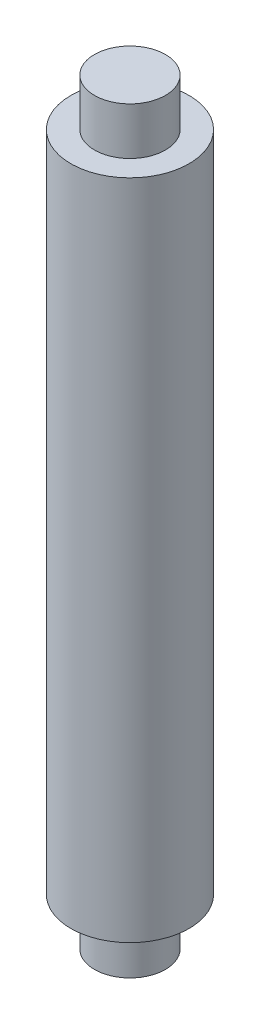
ISO-10303-21;
HEADER;
FILE_DESCRIPTION(('STEP AP214'),'2;1');
FILE_NAME('part.step','',(''),(''),'','','');
FILE_SCHEMA(('AUTOMOTIVE_DESIGN { 1 0 10303 214 1 1 1 1 }'));
ENDSEC;
DATA;
#1=APPLICATION_CONTEXT('core data for automotive mechanical design processes');
#2=APPLICATION_PROTOCOL_DEFINITION('international standard','automotive_design',2000,#1);
#3=PRODUCT_CONTEXT('',#1,'mechanical');
#4=PRODUCT('Part','Part','',(#3));
#5=PRODUCT_RELATED_PRODUCT_CATEGORY('part','',(#4));
#6=PRODUCT_DEFINITION_FORMATION('','',#4);
#7=PRODUCT_DEFINITION_CONTEXT('part definition',#1,'design');
#8=PRODUCT_DEFINITION('design','',#6,#7);
#9=PRODUCT_DEFINITION_SHAPE('','',#8);
#10=(LENGTH_UNIT() NAMED_UNIT(*) SI_UNIT(.MILLI.,.METRE.));
#11=(NAMED_UNIT(*) PLANE_ANGLE_UNIT() SI_UNIT($,.RADIAN.));
#12=(NAMED_UNIT(*) SI_UNIT($,.STERADIAN.) SOLID_ANGLE_UNIT());
#13=UNCERTAINTY_MEASURE_WITH_UNIT(LENGTH_MEASURE(1.E-05),#10,'distance_accuracy_value','');
#14=(GEOMETRIC_REPRESENTATION_CONTEXT(3) GLOBAL_UNCERTAINTY_ASSIGNED_CONTEXT((#13)) GLOBAL_UNIT_ASSIGNED_CONTEXT((#10,
#11,#12)) REPRESENTATION_CONTEXT('',''));
#15=CARTESIAN_POINT('',(0.,0.,0.));
#16=DIRECTION('',(0.,0.,1.));
#17=DIRECTION('',(1.,0.,0.));
#18=AXIS2_PLACEMENT_3D('',#15,#16,#17);
#19=CARTESIAN_POINT('',(-1.5,10.828947368421,0.));
#20=DIRECTION('',(0.,1.,0.));
#21=DIRECTION('',(-1.,0.,0.));
#22=AXIS2_PLACEMENT_3D('',#19,#20,#21);
#23=PLANE('',#22);
#24=CARTESIAN_POINT('',(0.,10.828947368421,0.));
#25=DIRECTION('',(0.,1.,0.));
#26=DIRECTION('',(-1.,0.,0.));
#27=AXIS2_PLACEMENT_3D('',#24,#25,#26);
#28=CIRCLE('',#27,1.5);
#29=CARTESIAN_POINT('',(-1.5,10.828947368421,0.));
#30=VERTEX_POINT('',#29);
#31=EDGE_CURVE('E59',#30,#30,#28,.T.);
#32=ORIENTED_EDGE('',*,*,#31,.T.);
#33=EDGE_LOOP('',(#32));
#34=FACE_BOUND('',#33,.T.);
#35=ADVANCED_FACE('F37',(#34),#23,.T.);
#36=CARTESIAN_POINT('',(0.,-21.171052631579,0.));
#37=DIRECTION('',(0.,-1.,0.));
#38=DIRECTION('',(1.,0.,0.));
#39=AXIS2_PLACEMENT_3D('',#36,#37,#38);
#40=PLANE('',#39);
#41=CARTESIAN_POINT('',(0.,-21.171052631579,0.));
#42=DIRECTION('',(0.,1.,0.));
#43=DIRECTION('',(-1.,0.,0.));
#44=AXIS2_PLACEMENT_3D('',#41,#42,#43);
#45=CIRCLE('',#44,1.5);
#46=CARTESIAN_POINT('',(-1.5,-21.171052631579,0.));
#47=VERTEX_POINT('',#46);
#48=EDGE_CURVE('E10',#47,#47,#45,.T.);
#49=ORIENTED_EDGE('',*,*,#48,.F.);
#50=EDGE_LOOP('',(#49));
#51=FACE_BOUND('',#50,.T.);
#52=ADVANCED_FACE('F76',(#51),#40,.T.);
#53=CARTESIAN_POINT('',(0.,10.828947368421,0.));
#54=DIRECTION('',(0.,1.,0.));
#55=DIRECTION('',(-1.,0.,0.));
#56=AXIS2_PLACEMENT_3D('',#53,#54,#55);
#57=CYLINDRICAL_SURFACE('',#56,1.5);
#58=ORIENTED_EDGE('',*,*,#48,.T.);
#59=EDGE_LOOP('',(#58));
#60=FACE_BOUND('',#59,.T.);
#61=CARTESIAN_POINT('',(0.,-19.171052631579,0.));
#62=DIRECTION('',(0.,1.,0.));
#63=DIRECTION('',(-1.,0.,0.));
#64=AXIS2_PLACEMENT_3D('',#61,#62,#63);
#65=CIRCLE('',#64,1.5);
#66=CARTESIAN_POINT('',(-1.5,-19.171052631579,0.));
#67=VERTEX_POINT('',#66);
#68=EDGE_CURVE('E43',#67,#67,#65,.T.);
#69=ORIENTED_EDGE('',*,*,#68,.F.);
#70=EDGE_LOOP('',(#69));
#71=FACE_BOUND('',#70,.T.);
#72=ADVANCED_FACE('F80',(#60,#71),#57,.T.);
#73=CARTESIAN_POINT('',(-1.5,-19.171052631579,0.));
#74=DIRECTION('',(0.,-1.,0.));
#75=DIRECTION('',(1.,0.,0.));
#76=AXIS2_PLACEMENT_3D('',#73,#74,#75);
#77=PLANE('',#76);
#78=ORIENTED_EDGE('',*,*,#68,.T.);
#79=EDGE_LOOP('',(#78));
#80=FACE_BOUND('',#79,.T.);
#81=CARTESIAN_POINT('',(0.,-19.171052631579,0.));
#82=DIRECTION('',(0.,1.,0.));
#83=DIRECTION('',(-1.,0.,0.));
#84=AXIS2_PLACEMENT_3D('',#81,#82,#83);
#85=CIRCLE('',#84,2.5);
#86=CARTESIAN_POINT('',(-2.5,-19.171052631579,0.));
#87=VERTEX_POINT('',#86);
#88=EDGE_CURVE('E47',#87,#87,#85,.T.);
#89=ORIENTED_EDGE('',*,*,#88,.F.);
#90=EDGE_LOOP('',(#89));
#91=FACE_BOUND('',#90,.T.);
#92=ADVANCED_FACE('F85',(#80,#91),#77,.T.);
#93=CARTESIAN_POINT('',(0.,10.828947368421,0.));
#94=DIRECTION('',(0.,1.,0.));
#95=DIRECTION('',(-1.,0.,0.));
#96=AXIS2_PLACEMENT_3D('',#93,#94,#95);
#97=CYLINDRICAL_SURFACE('',#96,2.5);
#98=ORIENTED_EDGE('',*,*,#88,.T.);
#99=EDGE_LOOP('',(#98));
#100=FACE_BOUND('',#99,.T.);
#101=CARTESIAN_POINT('',(0.,8.82894736842104,0.));
#102=DIRECTION('',(0.,1.,0.));
#103=DIRECTION('',(-1.,0.,0.));
#104=AXIS2_PLACEMENT_3D('',#101,#102,#103);
#105=CIRCLE('',#104,2.5);
#106=CARTESIAN_POINT('',(-2.5,8.82894736842104,0.));
#107=VERTEX_POINT('',#106);
#108=EDGE_CURVE('E51',#107,#107,#105,.T.);
#109=ORIENTED_EDGE('',*,*,#108,.F.);
#110=EDGE_LOOP('',(#109));
#111=FACE_BOUND('',#110,.T.);
#112=ADVANCED_FACE('F72',(#100,#111),#97,.T.);
#113=CARTESIAN_POINT('',(-2.5,8.82894736842104,0.));
#114=DIRECTION('',(0.,1.,0.));
#115=DIRECTION('',(-1.,0.,0.));
#116=AXIS2_PLACEMENT_3D('',#113,#114,#115);
#117=PLANE('',#116);
#118=ORIENTED_EDGE('',*,*,#108,.T.);
#119=EDGE_LOOP('',(#118));
#120=FACE_BOUND('',#119,.T.);
#121=CARTESIAN_POINT('',(0.,8.82894736842104,0.));
#122=DIRECTION('',(0.,1.,0.));
#123=DIRECTION('',(-1.,0.,0.));
#124=AXIS2_PLACEMENT_3D('',#121,#122,#123);
#125=CIRCLE('',#124,1.5);
#126=CARTESIAN_POINT('',(-1.5,8.82894736842104,0.));
#127=VERTEX_POINT('',#126);
#128=EDGE_CURVE('E56',#127,#127,#125,.T.);
#129=ORIENTED_EDGE('',*,*,#128,.F.);
#130=EDGE_LOOP('',(#129));
#131=FACE_BOUND('',#130,.T.);
#132=ADVANCED_FACE('F66',(#120,#131),#117,.T.);
#133=CARTESIAN_POINT('',(0.,10.828947368421,0.));
#134=DIRECTION('',(0.,1.,0.));
#135=DIRECTION('',(-1.,0.,0.));
#136=AXIS2_PLACEMENT_3D('',#133,#134,#135);
#137=CYLINDRICAL_SURFACE('',#136,1.5);
#138=ORIENTED_EDGE('',*,*,#128,.T.);
#139=EDGE_LOOP('',(#138));
#140=FACE_BOUND('',#139,.T.);
#141=ORIENTED_EDGE('',*,*,#31,.F.);
#142=EDGE_LOOP('',(#141));
#143=FACE_BOUND('',#142,.T.);
#144=ADVANCED_FACE('F64',(#140,#143),#137,.T.);
#145=CLOSED_SHELL('',(#35,#52,#72,#92,#112,#132,#144));
#146=MANIFOLD_SOLID_BREP('B2',#145);
#147=ADVANCED_BREP_SHAPE_REPRESENTATION('',(#18,#146),#14);
#148=SHAPE_DEFINITION_REPRESENTATION(#9,#147);
ENDSEC;
END-ISO-10303-21;
